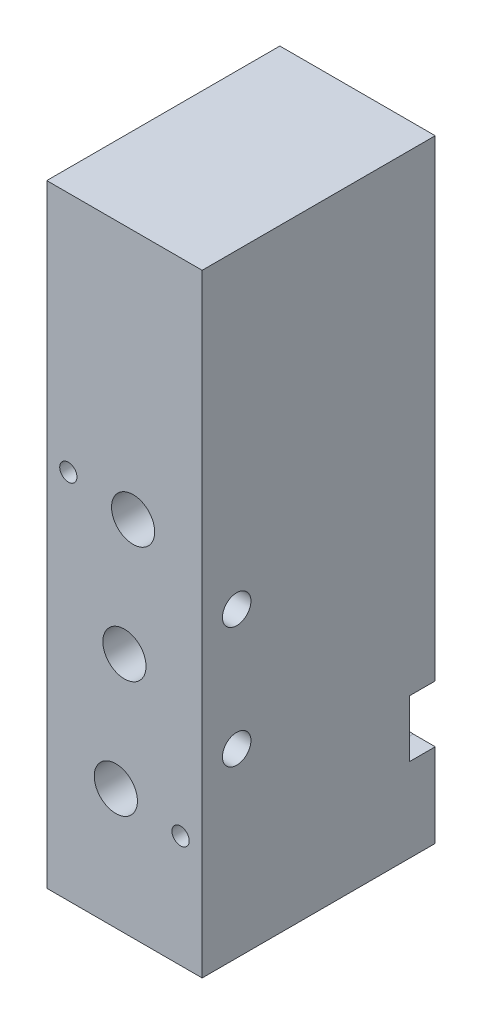
ISO-10303-21;
HEADER;
FILE_DESCRIPTION(('STEP AP214'),'2;1');
FILE_NAME('part.step','',(''),(''),'','','');
FILE_SCHEMA(('AUTOMOTIVE_DESIGN { 1 0 10303 214 1 1 1 1 }'));
ENDSEC;
DATA;
#1=APPLICATION_CONTEXT('core data for automotive mechanical design processes');
#2=APPLICATION_PROTOCOL_DEFINITION('international standard','automotive_design',2000,#1);
#3=PRODUCT_CONTEXT('',#1,'mechanical');
#4=PRODUCT('Part','Part','',(#3));
#5=PRODUCT_RELATED_PRODUCT_CATEGORY('part','',(#4));
#6=PRODUCT_DEFINITION_FORMATION('','',#4);
#7=PRODUCT_DEFINITION_CONTEXT('part definition',#1,'design');
#8=PRODUCT_DEFINITION('design','',#6,#7);
#9=PRODUCT_DEFINITION_SHAPE('','',#8);
#10=(LENGTH_UNIT() NAMED_UNIT(*) SI_UNIT(.MILLI.,.METRE.));
#11=(NAMED_UNIT(*) PLANE_ANGLE_UNIT() SI_UNIT($,.RADIAN.));
#12=(NAMED_UNIT(*) SI_UNIT($,.STERADIAN.) SOLID_ANGLE_UNIT());
#13=UNCERTAINTY_MEASURE_WITH_UNIT(LENGTH_MEASURE(1.E-05),#10,'distance_accuracy_value','');
#14=(GEOMETRIC_REPRESENTATION_CONTEXT(3) GLOBAL_UNCERTAINTY_ASSIGNED_CONTEXT((#13)) GLOBAL_UNIT_ASSIGNED_CONTEXT((#10,
#11,#12)) REPRESENTATION_CONTEXT('',''));
#15=CARTESIAN_POINT('',(0.,0.,0.));
#16=DIRECTION('',(0.,0.,1.));
#17=DIRECTION('',(1.,0.,0.));
#18=AXIS2_PLACEMENT_3D('',#15,#16,#17);
#19=CARTESIAN_POINT('',(18.,133.262052682356,-147.928733503639));
#20=DIRECTION('',(0.,0.,1.));
#21=DIRECTION('',(0.,-1.,0.));
#22=AXIS2_PLACEMENT_3D('',#19,#20,#21);
#23=PLANE('',#22);
#24=CARTESIAN_POINT('',(10.5,82.2620526823556,-147.928733503639));
#25=DIRECTION('',(0.,0.,-1.));
#26=DIRECTION('',(-1.,0.,0.));
#27=AXIS2_PLACEMENT_3D('',#24,#25,#26);
#28=CIRCLE('',#27,2.5);
#29=CARTESIAN_POINT('',(7.99999999999999,82.2620526823556,-147.928733503639));
#30=VERTEX_POINT('',#29);
#31=EDGE_CURVE('E194',#30,#30,#28,.T.);
#32=ORIENTED_EDGE('',*,*,#31,.F.);
#33=EDGE_LOOP('',(#32));
#34=FACE_BOUND('',#33,.T.);
#35=CARTESIAN_POINT('',(7.5,98.2620526823556,-147.928733503639));
#36=DIRECTION('',(0.,0.,-1.));
#37=DIRECTION('',(-1.,0.,0.));
#38=AXIS2_PLACEMENT_3D('',#35,#36,#37);
#39=CIRCLE('',#38,2.5);
#40=CARTESIAN_POINT('',(5.,98.2620526823556,-147.928733503639));
#41=VERTEX_POINT('',#40);
#42=EDGE_CURVE('E160',#41,#41,#39,.T.);
#43=ORIENTED_EDGE('',*,*,#42,.F.);
#44=EDGE_LOOP('',(#43));
#45=FACE_BOUND('',#44,.T.);
#46=CARTESIAN_POINT('',(9.,123.695505567184,-147.928733503639));
#47=DIRECTION('',(0.,0.,1.));
#48=DIRECTION('',(0.,-1.,0.));
#49=AXIS2_PLACEMENT_3D('',#46,#47,#48);
#50=CIRCLE('',#49,2.);
#51=CARTESIAN_POINT('',(9.,121.695505567184,-147.928733503639));
#52=VERTEX_POINT('',#51);
#53=EDGE_CURVE('E11',#52,#52,#50,.F.);
#54=ORIENTED_EDGE('',*,*,#53,.F.);
#55=EDGE_LOOP('',(#54));
#56=FACE_BOUND('',#55,.T.);
#57=DIRECTION('',(-1.,0.,0.));
#58=VECTOR('',#57,1.);
#59=CARTESIAN_POINT('',(0.,108.562052682356,-147.928733503639));
#60=LINE('',#59,#58);
#61=CARTESIAN_POINT('',(2.5,108.562052682356,-147.928733503639));
#62=VERTEX_POINT('',#61);
#63=CARTESIAN_POINT('',(0.,108.562052682356,-147.928733503639));
#64=VERTEX_POINT('',#63);
#65=EDGE_CURVE('E133',#62,#64,#60,.T.);
#66=ORIENTED_EDGE('',*,*,#65,.T.);
#67=DIRECTION('',(0.,1.,0.));
#68=VECTOR('',#67,1.);
#69=CARTESIAN_POINT('',(0.,133.262052682356,-147.928733503639));
#70=LINE('',#69,#68);
#71=CARTESIAN_POINT('',(0.,133.262052682356,-147.928733503639));
#72=VERTEX_POINT('',#71);
#73=EDGE_CURVE('E234',#64,#72,#70,.T.);
#74=ORIENTED_EDGE('',*,*,#73,.T.);
#75=DIRECTION('',(-1.,0.,0.));
#76=VECTOR('',#75,1.);
#77=CARTESIAN_POINT('',(18.,133.262052682356,-147.928733503639));
#78=LINE('',#77,#76);
#79=CARTESIAN_POINT('',(18.,133.262052682356,-147.928733503639));
#80=VERTEX_POINT('',#79);
#81=EDGE_CURVE('E241',#80,#72,#78,.T.);
#82=ORIENTED_EDGE('',*,*,#81,.F.);
#83=DIRECTION('',(0.,1.,0.));
#84=VECTOR('',#83,1.);
#85=CARTESIAN_POINT('',(18.,133.262052682356,-147.928733503639));
#86=LINE('',#85,#84);
#87=CARTESIAN_POINT('',(18.,78.5620526823556,-147.928733503639));
#88=VERTEX_POINT('',#87);
#89=EDGE_CURVE('E223',#88,#80,#86,.T.);
#90=ORIENTED_EDGE('',*,*,#89,.F.);
#91=DIRECTION('',(1.,0.,0.));
#92=VECTOR('',#91,1.);
#93=CARTESIAN_POINT('',(0.,78.5620526823556,-147.928733503639));
#94=LINE('',#93,#92);
#95=CARTESIAN_POINT('',(15.5,78.5620526823556,-147.928733503639));
#96=VERTEX_POINT('',#95);
#97=EDGE_CURVE('E178',#96,#88,#94,.T.);
#98=ORIENTED_EDGE('',*,*,#97,.F.);
#99=CARTESIAN_POINT('',(15.5,75.2620526823556,-147.928733503639));
#100=DIRECTION('',(0.,0.,-1.));
#101=DIRECTION('',(-1.,0.,0.));
#102=AXIS2_PLACEMENT_3D('',#99,#100,#101);
#103=CIRCLE('',#102,3.3);
#104=CARTESIAN_POINT('',(15.4517654315165,71.9624052123366,-147.928733503639));
#105=VERTEX_POINT('',#104);
#106=EDGE_CURVE('E175',#96,#105,#103,.F.);
#107=ORIENTED_EDGE('',*,*,#106,.T.);
#108=DIRECTION('',(1.,0.,0.));
#109=VECTOR('',#108,1.);
#110=CARTESIAN_POINT('',(0.,71.9624052123366,-147.928733503639));
#111=LINE('',#110,#109);
#112=CARTESIAN_POINT('',(18.,71.9624052123366,-147.928733503639));
#113=VERTEX_POINT('',#112);
#114=EDGE_CURVE('E168',#105,#113,#111,.T.);
#115=ORIENTED_EDGE('',*,*,#114,.T.);
#116=CARTESIAN_POINT('',(18.,62.2620526823556,-147.928733503639));
#117=VERTEX_POINT('',#116);
#118=EDGE_CURVE('E224',#117,#113,#86,.T.);
#119=ORIENTED_EDGE('',*,*,#118,.F.);
#120=DIRECTION('',(-1.,0.,0.));
#121=VECTOR('',#120,1.);
#122=CARTESIAN_POINT('',(18.,62.2620526823556,-147.928733503639));
#123=LINE('',#122,#121);
#124=CARTESIAN_POINT('',(0.,62.2620526823556,-147.928733503639));
#125=VERTEX_POINT('',#124);
#126=EDGE_CURVE('E244',#117,#125,#123,.T.);
#127=ORIENTED_EDGE('',*,*,#126,.T.);
#128=CARTESIAN_POINT('',(0.,101.962191241792,-147.928733503639));
#129=VERTEX_POINT('',#128);
#130=EDGE_CURVE('E235',#125,#129,#70,.T.);
#131=ORIENTED_EDGE('',*,*,#130,.T.);
#132=DIRECTION('',(-1.,0.,0.));
#133=VECTOR('',#132,1.);
#134=CARTESIAN_POINT('',(0.,101.962191241792,-147.928733503639));
#135=LINE('',#134,#133);
#136=CARTESIAN_POINT('',(2.53024025591688,101.962191241792,-147.928733503639));
#137=VERTEX_POINT('',#136);
#138=EDGE_CURVE('E145',#137,#129,#135,.T.);
#139=ORIENTED_EDGE('',*,*,#138,.F.);
#140=CARTESIAN_POINT('',(2.5,105.262052682356,-147.928733503639));
#141=DIRECTION('',(0.,0.,-1.));
#142=DIRECTION('',(-1.,0.,0.));
#143=AXIS2_PLACEMENT_3D('',#140,#141,#142);
#144=CIRCLE('',#143,3.3);
#145=EDGE_CURVE('E154',#62,#137,#144,.T.);
#146=ORIENTED_EDGE('',*,*,#145,.F.);
#147=EDGE_LOOP('',(#66,#74,#82,#90,#98,#107,#115,#119,#127,#131,#139,#146));
#148=FACE_BOUND('',#147,.T.);
#149=ADVANCED_FACE('F34',(#34,#45,#56,#148),#23,.F.);
#150=CARTESIAN_POINT('',(18.,0.,0.));
#151=DIRECTION('',(-1.,0.,0.));
#152=DIRECTION('',(0.,0.,1.));
#153=AXIS2_PLACEMENT_3D('',#150,#151,#152);
#154=PLANE('',#153);
#155=CARTESIAN_POINT('',(18.,83.2620526823556,-124.928733503639));
#156=DIRECTION('',(-1.,0.,0.));
#157=DIRECTION('',(0.,0.,1.));
#158=AXIS2_PLACEMENT_3D('',#155,#156,#157);
#159=CIRCLE('',#158,1.65);
#160=CARTESIAN_POINT('',(18.,83.2620526823556,-123.278733503639));
#161=VERTEX_POINT('',#160);
#162=EDGE_CURVE('E212',#161,#161,#159,.T.);
#163=ORIENTED_EDGE('',*,*,#162,.T.);
#164=EDGE_LOOP('',(#163));
#165=FACE_BOUND('',#164,.T.);
#166=CARTESIAN_POINT('',(18.,97.2620526823556,-124.928733503639));
#167=DIRECTION('',(-1.,0.,0.));
#168=DIRECTION('',(0.,0.,1.));
#169=AXIS2_PLACEMENT_3D('',#166,#167,#168);
#170=CIRCLE('',#169,1.65);
#171=CARTESIAN_POINT('',(18.,97.2620526823556,-123.278733503639));
#172=VERTEX_POINT('',#171);
#173=EDGE_CURVE('E205',#172,#172,#170,.T.);
#174=ORIENTED_EDGE('',*,*,#173,.T.);
#175=EDGE_LOOP('',(#174));
#176=FACE_BOUND('',#175,.T.);
#177=DIRECTION('',(0.,0.,-1.));
#178=VECTOR('',#177,1.);
#179=CARTESIAN_POINT('',(18.,71.9624052123366,-144.928733503639));
#180=LINE('',#179,#178);
#181=CARTESIAN_POINT('',(18.,71.9624052123366,-144.928733503639));
#182=VERTEX_POINT('',#181);
#183=EDGE_CURVE('E184',#182,#113,#180,.T.);
#184=ORIENTED_EDGE('',*,*,#183,.F.);
#185=DIRECTION('',(0.,-1.,0.));
#186=VECTOR('',#185,1.);
#187=CARTESIAN_POINT('',(18.,0.,-144.928733503639));
#188=LINE('',#187,#186);
#189=CARTESIAN_POINT('',(18.,78.5620526823556,-144.928733503639));
#190=VERTEX_POINT('',#189);
#191=EDGE_CURVE('E170',#190,#182,#188,.T.);
#192=ORIENTED_EDGE('',*,*,#191,.F.);
#193=DIRECTION('',(0.,0.,-1.));
#194=VECTOR('',#193,1.);
#195=CARTESIAN_POINT('',(18.,78.5620526823556,-144.928733503639));
#196=LINE('',#195,#194);
#197=EDGE_CURVE('E186',#190,#88,#196,.T.);
#198=ORIENTED_EDGE('',*,*,#197,.T.);
#199=ORIENTED_EDGE('',*,*,#89,.T.);
#200=DIRECTION('',(0.,0.,1.));
#201=VECTOR('',#200,1.);
#202=CARTESIAN_POINT('',(18.,133.262052682356,-120.928733503639));
#203=LINE('',#202,#201);
#204=CARTESIAN_POINT('',(18.,133.262052682356,-120.928733503639));
#205=VERTEX_POINT('',#204);
#206=EDGE_CURVE('E227',#80,#205,#203,.T.);
#207=ORIENTED_EDGE('',*,*,#206,.T.);
#208=DIRECTION('',(0.,-1.,0.));
#209=VECTOR('',#208,1.);
#210=CARTESIAN_POINT('',(18.,62.2620526823556,-120.928733503639));
#211=LINE('',#210,#209);
#212=CARTESIAN_POINT('',(18.,62.2620526823556,-120.928733503639));
#213=VERTEX_POINT('',#212);
#214=EDGE_CURVE('E217',#205,#213,#211,.T.);
#215=ORIENTED_EDGE('',*,*,#214,.T.);
#216=DIRECTION('',(0.,0.,-1.));
#217=VECTOR('',#216,1.);
#218=CARTESIAN_POINT('',(18.,62.2620526823556,-120.928733503639));
#219=LINE('',#218,#217);
#220=EDGE_CURVE('E220',#213,#117,#219,.T.);
#221=ORIENTED_EDGE('',*,*,#220,.T.);
#222=ORIENTED_EDGE('',*,*,#118,.T.);
#223=EDGE_LOOP('',(#184,#192,#198,#199,#207,#215,#221,#222));
#224=FACE_BOUND('',#223,.T.);
#225=ADVANCED_FACE('F312',(#165,#176,#224),#154,.F.);
#226=CARTESIAN_POINT('',(0.,0.,0.));
#227=DIRECTION('',(-1.,0.,0.));
#228=DIRECTION('',(0.,0.,1.));
#229=AXIS2_PLACEMENT_3D('',#226,#227,#228);
#230=PLANE('',#229);
#231=CARTESIAN_POINT('',(0.,97.2620526823556,-124.928733503639));
#232=DIRECTION('',(-1.,0.,0.));
#233=DIRECTION('',(0.,0.,1.));
#234=AXIS2_PLACEMENT_3D('',#231,#232,#233);
#235=CIRCLE('',#234,1.65);
#236=CARTESIAN_POINT('',(0.,97.2620526823556,-123.278733503639));
#237=VERTEX_POINT('',#236);
#238=EDGE_CURVE('E209',#237,#237,#235,.T.);
#239=ORIENTED_EDGE('',*,*,#238,.F.);
#240=EDGE_LOOP('',(#239));
#241=FACE_BOUND('',#240,.T.);
#242=CARTESIAN_POINT('',(0.,83.2620526823556,-124.928733503639));
#243=DIRECTION('',(-1.,0.,0.));
#244=DIRECTION('',(0.,0.,1.));
#245=AXIS2_PLACEMENT_3D('',#242,#243,#244);
#246=CIRCLE('',#245,1.65);
#247=CARTESIAN_POINT('',(0.,83.2620526823556,-123.278733503639));
#248=VERTEX_POINT('',#247);
#249=EDGE_CURVE('E204',#248,#248,#246,.T.);
#250=ORIENTED_EDGE('',*,*,#249,.F.);
#251=EDGE_LOOP('',(#250));
#252=FACE_BOUND('',#251,.T.);
#253=ORIENTED_EDGE('',*,*,#73,.F.);
#254=DIRECTION('',(0.,0.,-1.));
#255=VECTOR('',#254,1.);
#256=CARTESIAN_POINT('',(0.,108.562052682356,-144.928733503639));
#257=LINE('',#256,#255);
#258=CARTESIAN_POINT('',(0.,108.562052682356,-144.928733503639));
#259=VERTEX_POINT('',#258);
#260=EDGE_CURVE('E158',#259,#64,#257,.T.);
#261=ORIENTED_EDGE('',*,*,#260,.F.);
#262=DIRECTION('',(0.,1.,0.));
#263=VECTOR('',#262,1.);
#264=CARTESIAN_POINT('',(0.,0.,-144.928733503639));
#265=LINE('',#264,#263);
#266=CARTESIAN_POINT('',(0.,101.962191241792,-144.928733503639));
#267=VERTEX_POINT('',#266);
#268=EDGE_CURVE('E139',#267,#259,#265,.T.);
#269=ORIENTED_EDGE('',*,*,#268,.F.);
#270=DIRECTION('',(0.,0.,-1.));
#271=VECTOR('',#270,1.);
#272=CARTESIAN_POINT('',(0.,101.962191241792,-144.928733503639));
#273=LINE('',#272,#271);
#274=EDGE_CURVE('E161',#267,#129,#273,.T.);
#275=ORIENTED_EDGE('',*,*,#274,.T.);
#276=ORIENTED_EDGE('',*,*,#130,.F.);
#277=DIRECTION('',(0.,0.,-1.));
#278=VECTOR('',#277,1.);
#279=CARTESIAN_POINT('',(0.,62.2620526823556,-120.928733503639));
#280=LINE('',#279,#278);
#281=CARTESIAN_POINT('',(0.,62.2620526823556,-120.928733503639));
#282=VERTEX_POINT('',#281);
#283=EDGE_CURVE('E232',#282,#125,#280,.T.);
#284=ORIENTED_EDGE('',*,*,#283,.F.);
#285=DIRECTION('',(0.,-1.,0.));
#286=VECTOR('',#285,1.);
#287=CARTESIAN_POINT('',(0.,62.2620526823556,-120.928733503639));
#288=LINE('',#287,#286);
#289=CARTESIAN_POINT('',(0.,133.262052682356,-120.928733503639));
#290=VERTEX_POINT('',#289);
#291=EDGE_CURVE('E208',#290,#282,#288,.T.);
#292=ORIENTED_EDGE('',*,*,#291,.F.);
#293=DIRECTION('',(0.,0.,1.));
#294=VECTOR('',#293,1.);
#295=CARTESIAN_POINT('',(0.,133.262052682356,-120.928733503639));
#296=LINE('',#295,#294);
#297=EDGE_CURVE('E221',#72,#290,#296,.T.);
#298=ORIENTED_EDGE('',*,*,#297,.F.);
#299=EDGE_LOOP('',(#253,#261,#269,#275,#276,#284,#292,#298));
#300=FACE_BOUND('',#299,.T.);
#301=ADVANCED_FACE('F292',(#241,#252,#300),#230,.T.);
#302=CARTESIAN_POINT('',(18.,62.2620526823556,-120.928733503639));
#303=DIRECTION('',(0.,0.,-1.));
#304=DIRECTION('',(-1.,0.,0.));
#305=AXIS2_PLACEMENT_3D('',#302,#303,#304);
#306=PLANE('',#305);
#307=CARTESIAN_POINT('',(8.,76.2620526823556,-120.928733503639));
#308=DIRECTION('',(0.,0.,1.));
#309=DIRECTION('',(1.,0.,0.));
#310=AXIS2_PLACEMENT_3D('',#307,#308,#309);
#311=CIRCLE('',#310,2.5);
#312=CARTESIAN_POINT('',(10.5,76.2620526823556,-120.928733503639));
#313=VERTEX_POINT('',#312);
#314=EDGE_CURVE('E274',#313,#313,#311,.T.);
#315=ORIENTED_EDGE('',*,*,#314,.F.);
#316=EDGE_LOOP('',(#315));
#317=FACE_BOUND('',#316,.T.);
#318=CARTESIAN_POINT('',(9.,90.2620526823556,-120.928733503639));
#319=DIRECTION('',(0.,0.,1.));
#320=DIRECTION('',(1.,0.,0.));
#321=AXIS2_PLACEMENT_3D('',#318,#319,#320);
#322=CIRCLE('',#321,2.5);
#323=CARTESIAN_POINT('',(11.5,90.2620526823556,-120.928733503639));
#324=VERTEX_POINT('',#323);
#325=EDGE_CURVE('E268',#324,#324,#322,.T.);
#326=ORIENTED_EDGE('',*,*,#325,.F.);
#327=EDGE_LOOP('',(#326));
#328=FACE_BOUND('',#327,.T.);
#329=CARTESIAN_POINT('',(10.,104.262052682356,-120.928733503639));
#330=DIRECTION('',(0.,0.,1.));
#331=DIRECTION('',(1.,0.,0.));
#332=AXIS2_PLACEMENT_3D('',#329,#330,#331);
#333=CIRCLE('',#332,2.5);
#334=CARTESIAN_POINT('',(12.5,104.262052682356,-120.928733503639));
#335=VERTEX_POINT('',#334);
#336=EDGE_CURVE('E262',#335,#335,#333,.T.);
#337=ORIENTED_EDGE('',*,*,#336,.F.);
#338=EDGE_LOOP('',(#337));
#339=FACE_BOUND('',#338,.T.);
#340=CARTESIAN_POINT('',(2.5,105.262052682356,-120.928733503639));
#341=DIRECTION('',(0.,0.,-1.));
#342=DIRECTION('',(-1.,0.,0.));
#343=AXIS2_PLACEMENT_3D('',#340,#341,#342);
#344=CIRCLE('',#343,1.);
#345=CARTESIAN_POINT('',(1.5,105.262052682356,-120.928733503639));
#346=VERTEX_POINT('',#345);
#347=EDGE_CURVE('E250',#346,#346,#344,.T.);
#348=ORIENTED_EDGE('',*,*,#347,.T.);
#349=EDGE_LOOP('',(#348));
#350=FACE_BOUND('',#349,.T.);
#351=CARTESIAN_POINT('',(15.5,75.2620526823556,-120.928733503639));
#352=DIRECTION('',(0.,0.,-1.));
#353=DIRECTION('',(-1.,0.,0.));
#354=AXIS2_PLACEMENT_3D('',#351,#352,#353);
#355=CIRCLE('',#354,1.);
#356=CARTESIAN_POINT('',(14.5,75.2620526823556,-120.928733503639));
#357=VERTEX_POINT('',#356);
#358=EDGE_CURVE('E255',#357,#357,#355,.T.);
#359=ORIENTED_EDGE('',*,*,#358,.T.);
#360=EDGE_LOOP('',(#359));
#361=FACE_BOUND('',#360,.T.);
#362=ORIENTED_EDGE('',*,*,#291,.T.);
#363=DIRECTION('',(-1.,0.,0.));
#364=VECTOR('',#363,1.);
#365=CARTESIAN_POINT('',(18.,62.2620526823556,-120.928733503639));
#366=LINE('',#365,#364);
#367=EDGE_CURVE('E43',#213,#282,#366,.T.);
#368=ORIENTED_EDGE('',*,*,#367,.F.);
#369=ORIENTED_EDGE('',*,*,#214,.F.);
#370=DIRECTION('',(-1.,0.,0.));
#371=VECTOR('',#370,1.);
#372=CARTESIAN_POINT('',(18.,133.262052682356,-120.928733503639));
#373=LINE('',#372,#371);
#374=EDGE_CURVE('E229',#205,#290,#373,.T.);
#375=ORIENTED_EDGE('',*,*,#374,.T.);
#376=EDGE_LOOP('',(#362,#368,#369,#375));
#377=FACE_BOUND('',#376,.T.);
#378=ADVANCED_FACE('F36',(#317,#328,#339,#350,#361,#377),#306,.F.);
#379=CARTESIAN_POINT('',(18.,62.2620526823556,-120.928733503639));
#380=DIRECTION('',(0.,1.,0.));
#381=DIRECTION('',(0.,0.,1.));
#382=AXIS2_PLACEMENT_3D('',#379,#380,#381);
#383=PLANE('',#382);
#384=ORIENTED_EDGE('',*,*,#283,.T.);
#385=ORIENTED_EDGE('',*,*,#126,.F.);
#386=ORIENTED_EDGE('',*,*,#220,.F.);
#387=ORIENTED_EDGE('',*,*,#367,.T.);
#388=EDGE_LOOP('',(#384,#385,#386,#387));
#389=FACE_BOUND('',#388,.T.);
#390=ADVANCED_FACE('F291',(#389),#383,.F.);
#391=CARTESIAN_POINT('',(18.,133.262052682356,-120.928733503639));
#392=DIRECTION('',(0.,-1.,0.));
#393=DIRECTION('',(0.,0.,-1.));
#394=AXIS2_PLACEMENT_3D('',#391,#392,#393);
#395=PLANE('',#394);
#396=ORIENTED_EDGE('',*,*,#297,.T.);
#397=ORIENTED_EDGE('',*,*,#374,.F.);
#398=ORIENTED_EDGE('',*,*,#206,.F.);
#399=ORIENTED_EDGE('',*,*,#81,.T.);
#400=EDGE_LOOP('',(#396,#397,#398,#399));
#401=FACE_BOUND('',#400,.T.);
#402=ADVANCED_FACE('F317',(#401),#395,.F.);
#403=CARTESIAN_POINT('',(18.,83.2620526823556,-124.928733503639));
#404=DIRECTION('',(-1.,0.,0.));
#405=DIRECTION('',(0.,0.,1.));
#406=AXIS2_PLACEMENT_3D('',#403,#404,#405);
#407=CYLINDRICAL_SURFACE('',#406,1.65);
#408=ORIENTED_EDGE('',*,*,#162,.F.);
#409=EDGE_LOOP('',(#408));
#410=FACE_BOUND('',#409,.T.);
#411=ORIENTED_EDGE('',*,*,#249,.T.);
#412=EDGE_LOOP('',(#411));
#413=FACE_BOUND('',#412,.T.);
#414=ADVANCED_FACE('F358',(#410,#413),#407,.F.);
#415=CARTESIAN_POINT('',(18.,97.2620526823556,-124.928733503639));
#416=DIRECTION('',(-1.,0.,0.));
#417=DIRECTION('',(0.,0.,1.));
#418=AXIS2_PLACEMENT_3D('',#415,#416,#417);
#419=CYLINDRICAL_SURFACE('',#418,1.65);
#420=ORIENTED_EDGE('',*,*,#173,.F.);
#421=EDGE_LOOP('',(#420));
#422=FACE_BOUND('',#421,.T.);
#423=ORIENTED_EDGE('',*,*,#238,.T.);
#424=EDGE_LOOP('',(#423));
#425=FACE_BOUND('',#424,.T.);
#426=ADVANCED_FACE('F362',(#422,#425),#419,.F.);
#427=CARTESIAN_POINT('',(9.,123.695505567184,-150.428733503639));
#428=DIRECTION('',(0.,0.,1.));
#429=DIRECTION('',(1.,0.,0.));
#430=AXIS2_PLACEMENT_3D('',#427,#428,#429);
#431=CYLINDRICAL_SURFACE('',#430,2.);
#432=CARTESIAN_POINT('',(9.,123.695505567184,-150.428733503639));
#433=DIRECTION('',(0.,0.,-1.));
#434=DIRECTION('',(-1.,0.,0.));
#435=AXIS2_PLACEMENT_3D('',#432,#433,#434);
#436=CIRCLE('',#435,2.);
#437=CARTESIAN_POINT('',(7.,123.695505567184,-150.428733503639));
#438=VERTEX_POINT('',#437);
#439=EDGE_CURVE('E193',#438,#438,#436,.T.);
#440=ORIENTED_EDGE('',*,*,#439,.F.);
#441=EDGE_LOOP('',(#440));
#442=FACE_BOUND('',#441,.T.);
#443=ORIENTED_EDGE('',*,*,#53,.T.);
#444=EDGE_LOOP('',(#443));
#445=FACE_BOUND('',#444,.T.);
#446=ADVANCED_FACE('F368',(#442,#445),#431,.T.);
#447=CARTESIAN_POINT('',(9.,123.695505567184,-150.428733503639));
#448=DIRECTION('',(0.,0.,-1.));
#449=DIRECTION('',(-1.,0.,0.));
#450=AXIS2_PLACEMENT_3D('',#447,#448,#449);
#451=PLANE('',#450);
#452=ORIENTED_EDGE('',*,*,#439,.T.);
#453=EDGE_LOOP('',(#452));
#454=FACE_BOUND('',#453,.T.);
#455=ADVANCED_FACE('F484',(#454),#451,.T.);
#456=CARTESIAN_POINT('',(7.5,98.2620526823556,-143.928733503639));
#457=DIRECTION('',(0.,0.,-1.));
#458=DIRECTION('',(-1.,0.,0.));
#459=AXIS2_PLACEMENT_3D('',#456,#457,#458);
#460=CYLINDRICAL_SURFACE('',#459,2.5);
#461=CARTESIAN_POINT('',(7.5,98.2620526823556,-143.928733503639));
#462=DIRECTION('',(0.,0.,-1.));
#463=DIRECTION('',(-1.,0.,0.));
#464=AXIS2_PLACEMENT_3D('',#461,#462,#463);
#465=CIRCLE('',#464,2.5);
#466=CARTESIAN_POINT('',(5.,98.2620526823556,-143.928733503639));
#467=VERTEX_POINT('',#466);
#468=EDGE_CURVE('E197',#467,#467,#465,.T.);
#469=ORIENTED_EDGE('',*,*,#468,.F.);
#470=EDGE_LOOP('',(#469));
#471=FACE_BOUND('',#470,.T.);
#472=ORIENTED_EDGE('',*,*,#42,.T.);
#473=EDGE_LOOP('',(#472));
#474=FACE_BOUND('',#473,.T.);
#475=ADVANCED_FACE('F480',(#471,#474),#460,.F.);
#476=CARTESIAN_POINT('',(7.5,98.2620526823556,-143.928733503639));
#477=DIRECTION('',(0.,0.,-1.));
#478=DIRECTION('',(-1.,0.,0.));
#479=AXIS2_PLACEMENT_3D('',#476,#477,#478);
#480=PLANE('',#479);
#481=ORIENTED_EDGE('',*,*,#468,.T.);
#482=EDGE_LOOP('',(#481));
#483=FACE_BOUND('',#482,.T.);
#484=ADVANCED_FACE('F473',(#483),#480,.T.);
#485=CARTESIAN_POINT('',(10.5,82.2620526823556,-143.928733503639));
#486=DIRECTION('',(0.,0.,-1.));
#487=DIRECTION('',(-1.,0.,0.));
#488=AXIS2_PLACEMENT_3D('',#485,#486,#487);
#489=CYLINDRICAL_SURFACE('',#488,2.5);
#490=CARTESIAN_POINT('',(10.5,82.2620526823556,-143.928733503639));
#491=DIRECTION('',(0.,0.,-1.));
#492=DIRECTION('',(-1.,0.,0.));
#493=AXIS2_PLACEMENT_3D('',#490,#491,#492);
#494=CIRCLE('',#493,2.5);
#495=CARTESIAN_POINT('',(7.99999999999999,82.2620526823556,-143.928733503639));
#496=VERTEX_POINT('',#495);
#497=EDGE_CURVE('E190',#496,#496,#494,.T.);
#498=ORIENTED_EDGE('',*,*,#497,.F.);
#499=EDGE_LOOP('',(#498));
#500=FACE_BOUND('',#499,.T.);
#501=ORIENTED_EDGE('',*,*,#31,.T.);
#502=EDGE_LOOP('',(#501));
#503=FACE_BOUND('',#502,.T.);
#504=ADVANCED_FACE('F467',(#500,#503),#489,.F.);
#505=CARTESIAN_POINT('',(10.5,82.2620526823556,-143.928733503639));
#506=DIRECTION('',(0.,0.,-1.));
#507=DIRECTION('',(-1.,0.,0.));
#508=AXIS2_PLACEMENT_3D('',#505,#506,#507);
#509=PLANE('',#508);
#510=ORIENTED_EDGE('',*,*,#497,.T.);
#511=EDGE_LOOP('',(#510));
#512=FACE_BOUND('',#511,.T.);
#513=ADVANCED_FACE('F464',(#512),#509,.T.);
#514=CARTESIAN_POINT('',(0.,108.562052682356,-144.928733503639));
#515=DIRECTION('',(0.,-1.,0.));
#516=DIRECTION('',(0.,0.,-1.));
#517=AXIS2_PLACEMENT_3D('',#514,#515,#516);
#518=PLANE('',#517);
#519=ORIENTED_EDGE('',*,*,#65,.F.);
#520=DIRECTION('',(0.,0.,-1.));
#521=VECTOR('',#520,1.);
#522=CARTESIAN_POINT('',(2.5,108.562052682356,-144.928733503639));
#523=LINE('',#522,#521);
#524=CARTESIAN_POINT('',(2.5,108.562052682356,-144.928733503639));
#525=VERTEX_POINT('',#524);
#526=EDGE_CURVE('E128',#525,#62,#523,.T.);
#527=ORIENTED_EDGE('',*,*,#526,.F.);
#528=DIRECTION('',(-1.,0.,0.));
#529=VECTOR('',#528,1.);
#530=CARTESIAN_POINT('',(0.,108.562052682356,-144.928733503639));
#531=LINE('',#530,#529);
#532=EDGE_CURVE('E131',#525,#259,#531,.T.);
#533=ORIENTED_EDGE('',*,*,#532,.T.);
#534=ORIENTED_EDGE('',*,*,#260,.T.);
#535=EDGE_LOOP('',(#519,#527,#533,#534));
#536=FACE_BOUND('',#535,.T.);
#537=ADVANCED_FACE('F130',(#536),#518,.T.);
#538=CARTESIAN_POINT('',(0.,101.962191241792,-144.928733503639));
#539=DIRECTION('',(0.,-1.,0.));
#540=DIRECTION('',(0.,0.,-1.));
#541=AXIS2_PLACEMENT_3D('',#538,#539,#540);
#542=PLANE('',#541);
#543=ORIENTED_EDGE('',*,*,#138,.T.);
#544=ORIENTED_EDGE('',*,*,#274,.F.);
#545=DIRECTION('',(-1.,0.,0.));
#546=VECTOR('',#545,1.);
#547=CARTESIAN_POINT('',(0.,101.962191241792,-144.928733503639));
#548=LINE('',#547,#546);
#549=CARTESIAN_POINT('',(2.53024025591688,101.962191241792,-144.928733503639));
#550=VERTEX_POINT('',#549);
#551=EDGE_CURVE('E59',#550,#267,#548,.T.);
#552=ORIENTED_EDGE('',*,*,#551,.F.);
#553=DIRECTION('',(0.,0.,-1.));
#554=VECTOR('',#553,1.);
#555=CARTESIAN_POINT('',(2.53024025591688,101.962191241792,-144.928733503639));
#556=LINE('',#555,#554);
#557=EDGE_CURVE('E138',#550,#137,#556,.T.);
#558=ORIENTED_EDGE('',*,*,#557,.T.);
#559=EDGE_LOOP('',(#543,#544,#552,#558));
#560=FACE_BOUND('',#559,.T.);
#561=ADVANCED_FACE('F459',(#560),#542,.F.);
#562=CARTESIAN_POINT('',(2.5,105.262052682356,-144.928733503639));
#563=DIRECTION('',(0.,0.,-1.));
#564=DIRECTION('',(-1.,0.,0.));
#565=AXIS2_PLACEMENT_3D('',#562,#563,#564);
#566=CYLINDRICAL_SURFACE('',#565,3.3);
#567=ORIENTED_EDGE('',*,*,#145,.T.);
#568=ORIENTED_EDGE('',*,*,#557,.F.);
#569=CARTESIAN_POINT('',(2.5,105.262052682356,-144.928733503639));
#570=DIRECTION('',(0.,0.,-1.));
#571=DIRECTION('',(-1.,0.,0.));
#572=AXIS2_PLACEMENT_3D('',#569,#570,#571);
#573=CIRCLE('',#572,3.3);
#574=EDGE_CURVE('E142',#525,#550,#573,.T.);
#575=ORIENTED_EDGE('',*,*,#574,.F.);
#576=ORIENTED_EDGE('',*,*,#526,.T.);
#577=EDGE_LOOP('',(#567,#568,#575,#576));
#578=FACE_BOUND('',#577,.T.);
#579=ADVANCED_FACE('F147',(#578),#566,.F.);
#580=CARTESIAN_POINT('',(0.,0.,-144.928733503639));
#581=DIRECTION('',(0.,0.,-1.));
#582=DIRECTION('',(-1.,0.,0.));
#583=AXIS2_PLACEMENT_3D('',#580,#581,#582);
#584=PLANE('',#583);
#585=CARTESIAN_POINT('',(2.5,105.262052682356,-144.928733503639));
#586=DIRECTION('',(0.,0.,-1.));
#587=DIRECTION('',(-1.,0.,0.));
#588=AXIS2_PLACEMENT_3D('',#585,#586,#587);
#589=CIRCLE('',#588,1.);
#590=CARTESIAN_POINT('',(1.5,105.262052682356,-144.928733503639));
#591=VERTEX_POINT('',#590);
#592=EDGE_CURVE('E38',#591,#591,#589,.T.);
#593=ORIENTED_EDGE('',*,*,#592,.F.);
#594=EDGE_LOOP('',(#593));
#595=FACE_BOUND('',#594,.T.);
#596=ORIENTED_EDGE('',*,*,#532,.F.);
#597=ORIENTED_EDGE('',*,*,#574,.T.);
#598=ORIENTED_EDGE('',*,*,#551,.T.);
#599=ORIENTED_EDGE('',*,*,#268,.T.);
#600=EDGE_LOOP('',(#596,#597,#598,#599));
#601=FACE_BOUND('',#600,.T.);
#602=ADVANCED_FACE('F141',(#595,#601),#584,.T.);
#603=CARTESIAN_POINT('',(15.5,75.2620526823556,-144.928733503639));
#604=DIRECTION('',(0.,0.,-1.));
#605=DIRECTION('',(-1.,0.,0.));
#606=AXIS2_PLACEMENT_3D('',#603,#604,#605);
#607=CYLINDRICAL_SURFACE('',#606,3.3);
#608=ORIENTED_EDGE('',*,*,#106,.F.);
#609=DIRECTION('',(0.,0.,-1.));
#610=VECTOR('',#609,1.);
#611=CARTESIAN_POINT('',(15.5,78.5620526823556,-144.928733503639));
#612=LINE('',#611,#610);
#613=CARTESIAN_POINT('',(15.5,78.5620526823556,-144.928733503639));
#614=VERTEX_POINT('',#613);
#615=EDGE_CURVE('E174',#614,#96,#612,.T.);
#616=ORIENTED_EDGE('',*,*,#615,.F.);
#617=CARTESIAN_POINT('',(15.5,75.2620526823556,-144.928733503639));
#618=DIRECTION('',(0.,0.,-1.));
#619=DIRECTION('',(-1.,0.,0.));
#620=AXIS2_PLACEMENT_3D('',#617,#618,#619);
#621=CIRCLE('',#620,3.3);
#622=CARTESIAN_POINT('',(15.4517654315165,71.9624052123366,-144.928733503639));
#623=VERTEX_POINT('',#622);
#624=EDGE_CURVE('E165',#614,#623,#621,.F.);
#625=ORIENTED_EDGE('',*,*,#624,.T.);
#626=DIRECTION('',(0.,0.,-1.));
#627=VECTOR('',#626,1.);
#628=CARTESIAN_POINT('',(15.4517654315165,71.9624052123366,-144.928733503639));
#629=LINE('',#628,#627);
#630=EDGE_CURVE('E155',#623,#105,#629,.T.);
#631=ORIENTED_EDGE('',*,*,#630,.T.);
#632=EDGE_LOOP('',(#608,#616,#625,#631));
#633=FACE_BOUND('',#632,.T.);
#634=ADVANCED_FACE('F457',(#633),#607,.F.);
#635=CARTESIAN_POINT('',(0.,71.9624052123366,-144.928733503639));
#636=DIRECTION('',(0.,1.,0.));
#637=DIRECTION('',(0.,0.,1.));
#638=AXIS2_PLACEMENT_3D('',#635,#636,#637);
#639=PLANE('',#638);
#640=ORIENTED_EDGE('',*,*,#114,.F.);
#641=ORIENTED_EDGE('',*,*,#630,.F.);
#642=DIRECTION('',(1.,0.,0.));
#643=VECTOR('',#642,1.);
#644=CARTESIAN_POINT('',(0.,71.9624052123366,-144.928733503639));
#645=LINE('',#644,#643);
#646=EDGE_CURVE('E172',#623,#182,#645,.T.);
#647=ORIENTED_EDGE('',*,*,#646,.T.);
#648=ORIENTED_EDGE('',*,*,#183,.T.);
#649=EDGE_LOOP('',(#640,#641,#647,#648));
#650=FACE_BOUND('',#649,.T.);
#651=ADVANCED_FACE('F324',(#650),#639,.T.);
#652=CARTESIAN_POINT('',(0.,78.5620526823556,-144.928733503639));
#653=DIRECTION('',(0.,1.,0.));
#654=DIRECTION('',(0.,0.,1.));
#655=AXIS2_PLACEMENT_3D('',#652,#653,#654);
#656=PLANE('',#655);
#657=ORIENTED_EDGE('',*,*,#97,.T.);
#658=ORIENTED_EDGE('',*,*,#197,.F.);
#659=DIRECTION('',(1.,0.,0.));
#660=VECTOR('',#659,1.);
#661=CARTESIAN_POINT('',(0.,78.5620526823556,-144.928733503639));
#662=LINE('',#661,#660);
#663=EDGE_CURVE('E51',#614,#190,#662,.T.);
#664=ORIENTED_EDGE('',*,*,#663,.F.);
#665=ORIENTED_EDGE('',*,*,#615,.T.);
#666=EDGE_LOOP('',(#657,#658,#664,#665));
#667=FACE_BOUND('',#666,.T.);
#668=ADVANCED_FACE('F329',(#667),#656,.F.);
#669=CARTESIAN_POINT('',(0.,0.,-144.928733503639));
#670=DIRECTION('',(0.,0.,-1.));
#671=DIRECTION('',(-1.,0.,0.));
#672=AXIS2_PLACEMENT_3D('',#669,#670,#671);
#673=PLANE('',#672);
#674=CARTESIAN_POINT('',(15.5,75.2620526823556,-144.928733503639));
#675=DIRECTION('',(0.,0.,-1.));
#676=DIRECTION('',(-1.,0.,0.));
#677=AXIS2_PLACEMENT_3D('',#674,#675,#676);
#678=CIRCLE('',#677,1.);
#679=CARTESIAN_POINT('',(14.5,75.2620526823556,-144.928733503639));
#680=VERTEX_POINT('',#679);
#681=EDGE_CURVE('E248',#680,#680,#678,.T.);
#682=ORIENTED_EDGE('',*,*,#681,.F.);
#683=EDGE_LOOP('',(#682));
#684=FACE_BOUND('',#683,.T.);
#685=ORIENTED_EDGE('',*,*,#624,.F.);
#686=ORIENTED_EDGE('',*,*,#663,.T.);
#687=ORIENTED_EDGE('',*,*,#191,.T.);
#688=ORIENTED_EDGE('',*,*,#646,.F.);
#689=EDGE_LOOP('',(#685,#686,#687,#688));
#690=FACE_BOUND('',#689,.T.);
#691=ADVANCED_FACE('F326',(#684,#690),#673,.T.);
#692=CARTESIAN_POINT('',(15.5,75.2620526823556,-120.928733503639));
#693=DIRECTION('',(0.,0.,-1.));
#694=DIRECTION('',(-1.,0.,0.));
#695=AXIS2_PLACEMENT_3D('',#692,#693,#694);
#696=CYLINDRICAL_SURFACE('',#695,1.);
#697=ORIENTED_EDGE('',*,*,#681,.T.);
#698=EDGE_LOOP('',(#697));
#699=FACE_BOUND('',#698,.T.);
#700=ORIENTED_EDGE('',*,*,#358,.F.);
#701=EDGE_LOOP('',(#700));
#702=FACE_BOUND('',#701,.T.);
#703=ADVANCED_FACE('F328',(#699,#702),#696,.F.);
#704=CARTESIAN_POINT('',(2.5,105.262052682356,-120.928733503639));
#705=DIRECTION('',(0.,0.,-1.));
#706=DIRECTION('',(-1.,0.,0.));
#707=AXIS2_PLACEMENT_3D('',#704,#705,#706);
#708=CYLINDRICAL_SURFACE('',#707,1.);
#709=ORIENTED_EDGE('',*,*,#592,.T.);
#710=EDGE_LOOP('',(#709));
#711=FACE_BOUND('',#710,.T.);
#712=ORIENTED_EDGE('',*,*,#347,.F.);
#713=EDGE_LOOP('',(#712));
#714=FACE_BOUND('',#713,.T.);
#715=ADVANCED_FACE('F336',(#711,#714),#708,.F.);
#716=CARTESIAN_POINT('',(10.,104.262052682356,-124.928733503639));
#717=DIRECTION('',(0.,0.,1.));
#718=DIRECTION('',(1.,0.,0.));
#719=AXIS2_PLACEMENT_3D('',#716,#717,#718);
#720=CYLINDRICAL_SURFACE('',#719,2.5);
#721=CARTESIAN_POINT('',(10.,104.262052682356,-124.928733503639));
#722=DIRECTION('',(0.,0.,1.));
#723=DIRECTION('',(1.,0.,0.));
#724=AXIS2_PLACEMENT_3D('',#721,#722,#723);
#725=CIRCLE('',#724,2.5);
#726=CARTESIAN_POINT('',(12.5,104.262052682356,-124.928733503639));
#727=VERTEX_POINT('',#726);
#728=EDGE_CURVE('E265',#727,#727,#725,.T.);
#729=ORIENTED_EDGE('',*,*,#728,.F.);
#730=EDGE_LOOP('',(#729));
#731=FACE_BOUND('',#730,.T.);
#732=ORIENTED_EDGE('',*,*,#336,.T.);
#733=EDGE_LOOP('',(#732));
#734=FACE_BOUND('',#733,.T.);
#735=ADVANCED_FACE('F400',(#731,#734),#720,.F.);
#736=CARTESIAN_POINT('',(10.,104.262052682356,-124.928733503639));
#737=DIRECTION('',(0.,0.,1.));
#738=DIRECTION('',(1.,0.,0.));
#739=AXIS2_PLACEMENT_3D('',#736,#737,#738);
#740=PLANE('',#739);
#741=ORIENTED_EDGE('',*,*,#728,.T.);
#742=EDGE_LOOP('',(#741));
#743=FACE_BOUND('',#742,.T.);
#744=ADVANCED_FACE('F405',(#743),#740,.T.);
#745=CARTESIAN_POINT('',(9.,90.2620526823556,-124.928733503639));
#746=DIRECTION('',(0.,0.,1.));
#747=DIRECTION('',(1.,0.,0.));
#748=AXIS2_PLACEMENT_3D('',#745,#746,#747);
#749=CYLINDRICAL_SURFACE('',#748,2.5);
#750=CARTESIAN_POINT('',(9.,90.2620526823556,-124.928733503639));
#751=DIRECTION('',(0.,0.,1.));
#752=DIRECTION('',(1.,0.,0.));
#753=AXIS2_PLACEMENT_3D('',#750,#751,#752);
#754=CIRCLE('',#753,2.5);
#755=CARTESIAN_POINT('',(11.5,90.2620526823556,-124.928733503639));
#756=VERTEX_POINT('',#755);
#757=EDGE_CURVE('E271',#756,#756,#754,.T.);
#758=ORIENTED_EDGE('',*,*,#757,.F.);
#759=EDGE_LOOP('',(#758));
#760=FACE_BOUND('',#759,.T.);
#761=ORIENTED_EDGE('',*,*,#325,.T.);
#762=EDGE_LOOP('',(#761));
#763=FACE_BOUND('',#762,.T.);
#764=ADVANCED_FACE('F415',(#760,#763),#749,.F.);
#765=CARTESIAN_POINT('',(9.,90.2620526823556,-124.928733503639));
#766=DIRECTION('',(0.,0.,1.));
#767=DIRECTION('',(1.,0.,0.));
#768=AXIS2_PLACEMENT_3D('',#765,#766,#767);
#769=PLANE('',#768);
#770=ORIENTED_EDGE('',*,*,#757,.T.);
#771=EDGE_LOOP('',(#770));
#772=FACE_BOUND('',#771,.T.);
#773=ADVANCED_FACE('F285',(#772),#769,.T.);
#774=CARTESIAN_POINT('',(8.,76.2620526823556,-124.928733503639));
#775=DIRECTION('',(0.,0.,1.));
#776=DIRECTION('',(1.,0.,0.));
#777=AXIS2_PLACEMENT_3D('',#774,#775,#776);
#778=CYLINDRICAL_SURFACE('',#777,2.5);
#779=CARTESIAN_POINT('',(8.,76.2620526823556,-124.928733503639));
#780=DIRECTION('',(0.,0.,1.));
#781=DIRECTION('',(1.,0.,0.));
#782=AXIS2_PLACEMENT_3D('',#779,#780,#781);
#783=CIRCLE('',#782,2.5);
#784=CARTESIAN_POINT('',(10.5,76.2620526823556,-124.928733503639));
#785=VERTEX_POINT('',#784);
#786=EDGE_CURVE('E260',#785,#785,#783,.T.);
#787=ORIENTED_EDGE('',*,*,#786,.F.);
#788=EDGE_LOOP('',(#787));
#789=FACE_BOUND('',#788,.T.);
#790=ORIENTED_EDGE('',*,*,#314,.T.);
#791=EDGE_LOOP('',(#790));
#792=FACE_BOUND('',#791,.T.);
#793=ADVANCED_FACE('F282',(#789,#792),#778,.F.);
#794=CARTESIAN_POINT('',(8.,76.2620526823556,-124.928733503639));
#795=DIRECTION('',(0.,0.,1.));
#796=DIRECTION('',(1.,0.,0.));
#797=AXIS2_PLACEMENT_3D('',#794,#795,#796);
#798=PLANE('',#797);
#799=ORIENTED_EDGE('',*,*,#786,.T.);
#800=EDGE_LOOP('',(#799));
#801=FACE_BOUND('',#800,.T.);
#802=ADVANCED_FACE('F280',(#801),#798,.T.);
#803=CLOSED_SHELL('',(#149,#225,#301,#378,#390,#402,#414,#426,#446,#455,#475,#484,#504,#513,
#537,#561,#579,#602,#634,#651,#668,#691,#703,#715,#735,#744,#764,#773,#793,#802));
#804=MANIFOLD_SOLID_BREP('B2',#803);
#805=ADVANCED_BREP_SHAPE_REPRESENTATION('',(#18,#804),#14);
#806=SHAPE_DEFINITION_REPRESENTATION(#9,#805);
ENDSEC;
END-ISO-10303-21;
